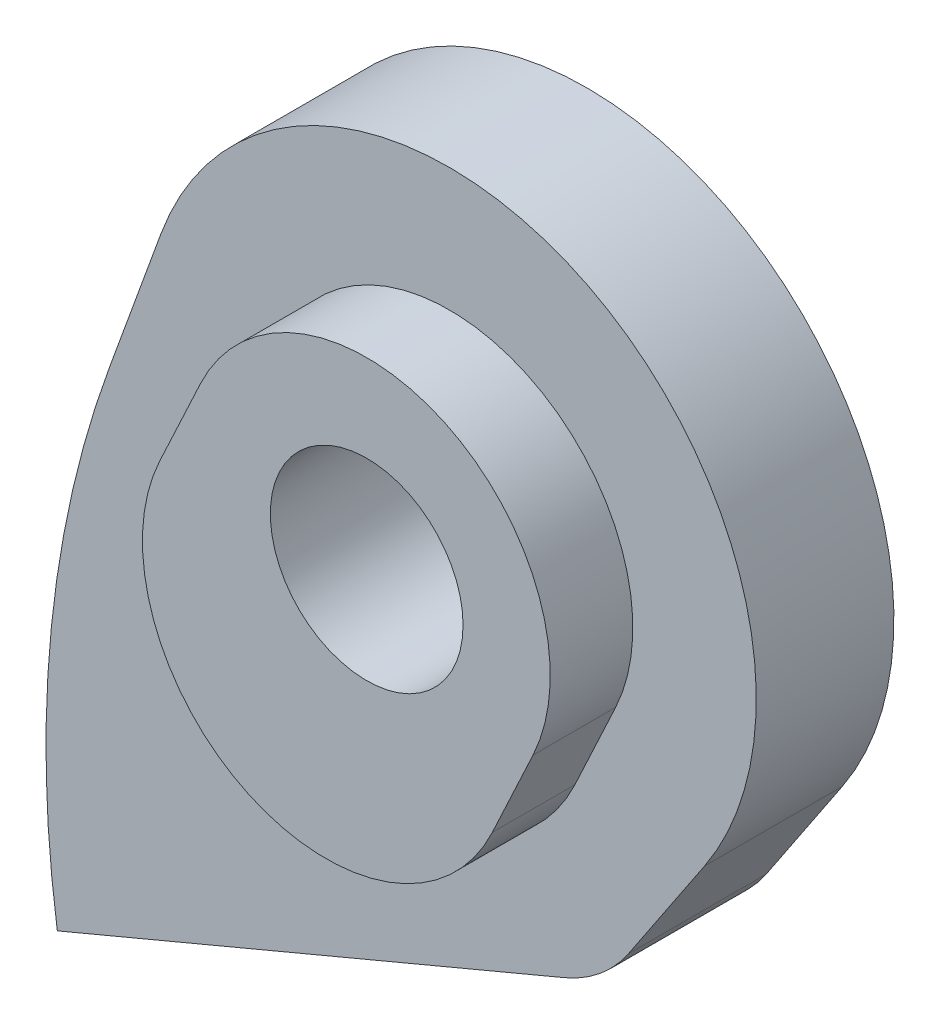
ISO-10303-21;
HEADER;
FILE_DESCRIPTION(('STEP AP214'),'2;1');
FILE_NAME('part.step','',(''),(''),'','','');
FILE_SCHEMA(('AUTOMOTIVE_DESIGN { 1 0 10303 214 1 1 1 1 }'));
ENDSEC;
DATA;
#1=APPLICATION_CONTEXT('core data for automotive mechanical design processes');
#2=APPLICATION_PROTOCOL_DEFINITION('international standard','automotive_design',2000,#1);
#3=PRODUCT_CONTEXT('',#1,'mechanical');
#4=PRODUCT('Part','Part','',(#3));
#5=PRODUCT_RELATED_PRODUCT_CATEGORY('part','',(#4));
#6=PRODUCT_DEFINITION_FORMATION('','',#4);
#7=PRODUCT_DEFINITION_CONTEXT('part definition',#1,'design');
#8=PRODUCT_DEFINITION('design','',#6,#7);
#9=PRODUCT_DEFINITION_SHAPE('','',#8);
#10=(LENGTH_UNIT() NAMED_UNIT(*) SI_UNIT(.MILLI.,.METRE.));
#11=(NAMED_UNIT(*) PLANE_ANGLE_UNIT() SI_UNIT($,.RADIAN.));
#12=(NAMED_UNIT(*) SI_UNIT($,.STERADIAN.) SOLID_ANGLE_UNIT());
#13=UNCERTAINTY_MEASURE_WITH_UNIT(LENGTH_MEASURE(1.E-05),#10,'distance_accuracy_value','');
#14=(GEOMETRIC_REPRESENTATION_CONTEXT(3) GLOBAL_UNCERTAINTY_ASSIGNED_CONTEXT((#13)) GLOBAL_UNIT_ASSIGNED_CONTEXT((#10,
#11,#12)) REPRESENTATION_CONTEXT('',''));
#15=CARTESIAN_POINT('',(0.,0.,0.));
#16=DIRECTION('',(0.,0.,1.));
#17=DIRECTION('',(1.,0.,0.));
#18=AXIS2_PLACEMENT_3D('',#15,#16,#17);
#19=CARTESIAN_POINT('',(0.11468761398859,80.1325343968941,0.));
#20=DIRECTION('',(0.,0.,1.));
#21=DIRECTION('',(1.,0.,0.));
#22=AXIS2_PLACEMENT_3D('',#19,#20,#21);
#23=PLANE('',#22);
#24=CARTESIAN_POINT('',(14.2795120747355,71.4970986035797,0.));
#25=DIRECTION('',(0.,0.,1.));
#26=DIRECTION('',(1.,0.,0.));
#27=AXIS2_PLACEMENT_3D('',#24,#25,#26);
#28=CIRCLE('',#27,22.9540740082007);
#29=CARTESIAN_POINT('',(-7.29026188774433,79.3478542857725,0.));
#30=VERTEX_POINT('',#29);
#31=CARTESIAN_POINT('',(-8.42769677737512,68.1396919078421,0.));
#32=VERTEX_POINT('',#31);
#33=EDGE_CURVE('E154',#30,#32,#28,.T.);
#34=ORIENTED_EDGE('',*,*,#33,.T.);
#35=DIRECTION('',(-0.921960246209325,-0.387284526426812,0.));
#36=VECTOR('',#35,1.);
#37=CARTESIAN_POINT('',(2.62584420432856,72.7829131335289,0.));
#38=LINE('',#37,#36);
#39=CARTESIAN_POINT('',(2.62584420432857,72.7829131335288,0.));
#40=VERTEX_POINT('',#39);
#41=EDGE_CURVE('E178',#40,#32,#38,.T.);
#42=ORIENTED_EDGE('',*,*,#41,.F.);
#43=CARTESIAN_POINT('',(1.41064938117233,75.6757767567832,0.));
#44=DIRECTION('',(0.,0.,-1.));
#45=DIRECTION('',(-1.,0.,0.));
#46=AXIS2_PLACEMENT_3D('',#43,#44,#45);
#47=CIRCLE('',#46,3.13773140994799);
#48=CARTESIAN_POINT('',(4.02035151590427,73.933705240183,0.));
#49=VERTEX_POINT('',#48);
#50=EDGE_CURVE('E173',#49,#40,#47,.T.);
#51=ORIENTED_EDGE('',*,*,#50,.F.);
#52=DIRECTION('',(0.555200968150768,0.831716228628761,0.));
#53=VECTOR('',#52,1.);
#54=CARTESIAN_POINT('',(4.02035151590429,73.933705240183,0.));
#55=LINE('',#54,#53);
#56=CARTESIAN_POINT('',(5.67886918351501,76.4182399199654,0.));
#57=VERTEX_POINT('',#56);
#58=EDGE_CURVE('E147',#49,#57,#55,.T.);
#59=ORIENTED_EDGE('',*,*,#58,.T.);
#60=CARTESIAN_POINT('',(0.11468761398859,80.1325343968941,0.));
#61=DIRECTION('',(0.,0.,1.));
#62=DIRECTION('',(1.,0.,0.));
#63=AXIS2_PLACEMENT_3D('',#60,#61,#62);
#64=CIRCLE('',#63,6.69000000000006);
#65=CARTESIAN_POINT('',(-6.17185601906935,82.4206491557424,0.));
#66=VERTEX_POINT('',#65);
#67=EDGE_CURVE('E149',#57,#66,#64,.T.);
#68=ORIENTED_EDGE('',*,*,#67,.T.);
#69=DIRECTION('',(-0.342020143325666,-0.939692620785909,0.));
#70=VECTOR('',#69,1.);
#71=CARTESIAN_POINT('',(-6.1718560190694,82.4206491557424,0.));
#72=LINE('',#71,#70);
#73=EDGE_CURVE('E155',#66,#30,#72,.T.);
#74=ORIENTED_EDGE('',*,*,#73,.T.);
#75=EDGE_LOOP('',(#34,#42,#51,#59,#68,#74));
#76=FACE_BOUND('',#75,.T.);
#77=DIRECTION('',(-0.4226182617407,-0.90630778703665,0.));
#78=VECTOR('',#77,1.);
#79=CARTESIAN_POINT('',(-3.51054353415801,81.8230074438569,0.));
#80=LINE('',#79,#78);
#81=CARTESIAN_POINT('',(-3.51054353415801,81.8230074438569,0.));
#82=VERTEX_POINT('',#81);
#83=CARTESIAN_POINT('',(-4.39804188381347,79.9197610910799,0.));
#84=VERTEX_POINT('',#83);
#85=EDGE_CURVE('E241',#82,#84,#80,.T.);
#86=ORIENTED_EDGE('',*,*,#85,.F.);
#87=CARTESIAN_POINT('',(0.114687613988609,80.1325343968941,0.));
#88=DIRECTION('',(0.,0.,1.));
#89=DIRECTION('',(1.,0.,0.));
#90=AXIS2_PLACEMENT_3D('',#87,#88,#89);
#91=CIRCLE('',#90,4.00000000000001);
#92=CARTESIAN_POINT('',(3.73991876213519,78.4420613499313,0.));
#93=VERTEX_POINT('',#92);
#94=EDGE_CURVE('E145',#93,#82,#91,.T.);
#95=ORIENTED_EDGE('',*,*,#94,.F.);
#96=DIRECTION('',(0.4226182617407,0.90630778703665,0.));
#97=VECTOR('',#96,1.);
#98=CARTESIAN_POINT('',(3.73991876213519,78.4420613499313,0.));
#99=LINE('',#98,#97);
#100=CARTESIAN_POINT('',(2.85242041247973,76.5388149971543,0.));
#101=VERTEX_POINT('',#100);
#102=EDGE_CURVE('E141',#101,#93,#99,.T.);
#103=ORIENTED_EDGE('',*,*,#102,.F.);
#104=CARTESIAN_POINT('',(-0.772810735666862,78.2292880441171,0.));
#105=DIRECTION('',(0.,0.,1.));
#106=DIRECTION('',(1.,0.,0.));
#107=AXIS2_PLACEMENT_3D('',#104,#105,#106);
#108=CIRCLE('',#107,4.00000000000001);
#109=EDGE_CURVE('E243',#84,#101,#108,.T.);
#110=ORIENTED_EDGE('',*,*,#109,.F.);
#111=EDGE_LOOP('',(#86,#95,#103,#110));
#112=FACE_BOUND('',#111,.T.);
#113=ADVANCED_FACE('F33',(#76,#112),#23,.T.);
#114=CARTESIAN_POINT('',(-8.01359795678153,76.9658058271043,-6.));
#115=DIRECTION('',(-0.921960246209324,-0.387284526426815,0.));
#116=DIRECTION('',(0.387284526426815,-0.921960246209324,0.));
#117=AXIS2_PLACEMENT_3D('',#114,#115,#116);
#118=PLANE('',#117);
#119=DIRECTION('',(0.387284526426815,-0.921960246209324,0.));
#120=VECTOR('',#119,1.);
#121=CARTESIAN_POINT('',(-8.01359795678153,76.9658058271043,-3.));
#122=LINE('',#121,#120);
#123=CARTESIAN_POINT('',(-8.01359795678153,76.9658058271043,-3.));
#124=VERTEX_POINT('',#123);
#125=CARTESIAN_POINT('',(-4.92424784177968,69.611373108264,-3.));
#126=VERTEX_POINT('',#125);
#127=EDGE_CURVE('E56',#124,#126,#122,.T.);
#128=ORIENTED_EDGE('',*,*,#127,.T.);
#129=DIRECTION('',(0.,0.,1.));
#130=VECTOR('',#129,1.);
#131=CARTESIAN_POINT('',(-4.92424784177968,69.611373108264,-6.));
#132=LINE('',#131,#130);
#133=CARTESIAN_POINT('',(-4.92424784177968,69.611373108264,-6.));
#134=VERTEX_POINT('',#133);
#135=EDGE_CURVE('E166',#134,#126,#132,.T.);
#136=ORIENTED_EDGE('',*,*,#135,.F.);
#137=DIRECTION('',(0.387284526426815,-0.921960246209324,0.));
#138=VECTOR('',#137,1.);
#139=CARTESIAN_POINT('',(-8.01359795678153,76.9658058271043,-6.));
#140=LINE('',#139,#138);
#141=CARTESIAN_POINT('',(-8.01359795678153,76.9658058271043,-6.));
#142=VERTEX_POINT('',#141);
#143=EDGE_CURVE('E164',#142,#134,#140,.T.);
#144=ORIENTED_EDGE('',*,*,#143,.F.);
#145=DIRECTION('',(0.,0.,1.));
#146=VECTOR('',#145,1.);
#147=CARTESIAN_POINT('',(-8.01359795678153,76.9658058271043,-6.));
#148=LINE('',#147,#146);
#149=EDGE_CURVE('E170',#142,#124,#148,.T.);
#150=ORIENTED_EDGE('',*,*,#149,.T.);
#151=EDGE_LOOP('',(#128,#136,#144,#150));
#152=FACE_BOUND('',#151,.T.);
#153=ADVANCED_FACE('F230',(#152),#118,.F.);
#154=CARTESIAN_POINT('',(14.2795120747355,71.4970986035797,-6.));
#155=DIRECTION('',(0.,0.,1.));
#156=DIRECTION('',(1.,0.,0.));
#157=AXIS2_PLACEMENT_3D('',#154,#155,#156);
#158=PLANE('',#157);
#159=DIRECTION('',(-0.921960246209326,-0.38728452642681,0.));
#160=VECTOR('',#159,1.);
#161=CARTESIAN_POINT('',(-4.92424784177968,69.611373108264,-6.));
#162=LINE('',#161,#160);
#163=CARTESIAN_POINT('',(-8.42769677737511,68.1396919078421,-6.));
#164=VERTEX_POINT('',#163);
#165=EDGE_CURVE('E159',#134,#164,#162,.T.);
#166=ORIENTED_EDGE('',*,*,#165,.T.);
#167=CARTESIAN_POINT('',(14.2795120747355,71.4970986035797,-6.));
#168=DIRECTION('',(0.,0.,-1.));
#169=DIRECTION('',(1.,0.,0.));
#170=AXIS2_PLACEMENT_3D('',#167,#168,#169);
#171=CIRCLE('',#170,22.9540740082007);
#172=EDGE_CURVE('E162',#164,#142,#171,.T.);
#173=ORIENTED_EDGE('',*,*,#172,.T.);
#174=ORIENTED_EDGE('',*,*,#143,.T.);
#175=EDGE_LOOP('',(#166,#173,#174));
#176=FACE_BOUND('',#175,.T.);
#177=ADVANCED_FACE('F281',(#176),#158,.F.);
#178=CARTESIAN_POINT('',(0.11468761398859,80.1325343968941,-3.));
#179=DIRECTION('',(0.,0.,1.));
#180=DIRECTION('',(1.,0.,0.));
#181=AXIS2_PLACEMENT_3D('',#178,#179,#180);
#182=PLANE('',#181);
#183=CARTESIAN_POINT('',(0.11468761398859,80.1325343968941,-3.));
#184=DIRECTION('',(0.,0.,1.));
#185=DIRECTION('',(1.,0.,0.));
#186=AXIS2_PLACEMENT_3D('',#183,#184,#185);
#187=CIRCLE('',#186,2.10000000000001);
#188=CARTESIAN_POINT('',(2.2146876139886,80.1325343968941,-3.));
#189=VERTEX_POINT('',#188);
#190=EDGE_CURVE('E246',#189,#189,#187,.T.);
#191=ORIENTED_EDGE('',*,*,#190,.T.);
#192=EDGE_LOOP('',(#191));
#193=FACE_BOUND('',#192,.T.);
#194=ORIENTED_EDGE('',*,*,#127,.F.);
#195=CARTESIAN_POINT('',(14.2795120747355,71.4970986035797,-3.));
#196=DIRECTION('',(0.,0.,-1.));
#197=DIRECTION('',(-1.,0.,0.));
#198=AXIS2_PLACEMENT_3D('',#195,#196,#197);
#199=CIRCLE('',#198,22.9540740082007);
#200=CARTESIAN_POINT('',(-7.29026188774433,79.3478542857725,-3.));
#201=VERTEX_POINT('',#200);
#202=EDGE_CURVE('E184',#124,#201,#199,.T.);
#203=ORIENTED_EDGE('',*,*,#202,.T.);
#204=DIRECTION('',(0.342020143325687,0.939692620785902,0.));
#205=VECTOR('',#204,1.);
#206=CARTESIAN_POINT('',(-6.17185601906934,82.4206491557424,-3.));
#207=LINE('',#206,#205);
#208=CARTESIAN_POINT('',(-6.17185601906934,82.4206491557424,-3.));
#209=VERTEX_POINT('',#208);
#210=EDGE_CURVE('E186',#201,#209,#207,.T.);
#211=ORIENTED_EDGE('',*,*,#210,.T.);
#212=CARTESIAN_POINT('',(0.11468761398859,80.1325343968941,-3.));
#213=DIRECTION('',(0.,0.,-1.));
#214=DIRECTION('',(1.,0.,0.));
#215=AXIS2_PLACEMENT_3D('',#212,#213,#214);
#216=CIRCLE('',#215,6.69000000000002);
#217=CARTESIAN_POINT('',(5.67886918351501,76.4182399199654,-3.));
#218=VERTEX_POINT('',#217);
#219=EDGE_CURVE('E174',#209,#218,#216,.T.);
#220=ORIENTED_EDGE('',*,*,#219,.T.);
#221=DIRECTION('',(-0.555200968150769,-0.83171622862876,0.));
#222=VECTOR('',#221,1.);
#223=CARTESIAN_POINT('',(5.67886918351501,76.4182399199654,-3.));
#224=LINE('',#223,#222);
#225=CARTESIAN_POINT('',(4.02035151590429,73.933705240183,-3.));
#226=VERTEX_POINT('',#225);
#227=EDGE_CURVE('E177',#218,#226,#224,.T.);
#228=ORIENTED_EDGE('',*,*,#227,.T.);
#229=CARTESIAN_POINT('',(1.41064938117233,75.6757767567832,-3.));
#230=DIRECTION('',(0.,0.,-1.));
#231=DIRECTION('',(-1.,0.,0.));
#232=AXIS2_PLACEMENT_3D('',#229,#230,#231);
#233=CIRCLE('',#232,3.13773140994799);
#234=CARTESIAN_POINT('',(2.62584420432857,72.7829131335288,-3.));
#235=VERTEX_POINT('',#234);
#236=EDGE_CURVE('E180',#226,#235,#233,.T.);
#237=ORIENTED_EDGE('',*,*,#236,.T.);
#238=DIRECTION('',(-0.921960246209325,-0.387284526426812,0.));
#239=VECTOR('',#238,1.);
#240=CARTESIAN_POINT('',(2.62584420432856,72.7829131335289,-3.));
#241=LINE('',#240,#239);
#242=EDGE_CURVE('E182',#235,#126,#241,.T.);
#243=ORIENTED_EDGE('',*,*,#242,.T.);
#244=EDGE_LOOP('',(#194,#203,#211,#220,#228,#237,#243));
#245=FACE_BOUND('',#244,.T.);
#246=ADVANCED_FACE('F212',(#193,#245),#182,.F.);
#247=CARTESIAN_POINT('',(1.41064938117233,75.6757767567832,-3.));
#248=DIRECTION('',(0.,0.,1.));
#249=DIRECTION('',(1.,0.,0.));
#250=AXIS2_PLACEMENT_3D('',#247,#248,#249);
#251=CYLINDRICAL_SURFACE('',#250,3.13773140994799);
#252=ORIENTED_EDGE('',*,*,#50,.T.);
#253=DIRECTION('',(0.,0.,1.));
#254=VECTOR('',#253,1.);
#255=CARTESIAN_POINT('',(2.62584420432857,72.7829131335288,-3.));
#256=LINE('',#255,#254);
#257=EDGE_CURVE('E196',#235,#40,#256,.T.);
#258=ORIENTED_EDGE('',*,*,#257,.F.);
#259=ORIENTED_EDGE('',*,*,#236,.F.);
#260=DIRECTION('',(0.,0.,1.));
#261=VECTOR('',#260,1.);
#262=CARTESIAN_POINT('',(4.02035151590429,73.933705240183,-3.));
#263=LINE('',#262,#261);
#264=EDGE_CURVE('E199',#226,#49,#263,.T.);
#265=ORIENTED_EDGE('',*,*,#264,.T.);
#266=EDGE_LOOP('',(#252,#258,#259,#265));
#267=FACE_BOUND('',#266,.T.);
#268=ADVANCED_FACE('F223',(#267),#251,.T.);
#269=CARTESIAN_POINT('',(2.62584420432856,72.7829131335289,-3.));
#270=DIRECTION('',(-0.387284526426812,0.921960246209325,0.));
#271=DIRECTION('',(-0.921960246209325,-0.387284526426812,0.));
#272=AXIS2_PLACEMENT_3D('',#269,#270,#271);
#273=PLANE('',#272);
#274=ORIENTED_EDGE('',*,*,#41,.T.);
#275=DIRECTION('',(0.,0.,1.));
#276=VECTOR('',#275,1.);
#277=CARTESIAN_POINT('',(-8.42769677737511,68.1396919078421,-3.));
#278=LINE('',#277,#276);
#279=EDGE_CURVE('E189',#164,#32,#278,.T.);
#280=ORIENTED_EDGE('',*,*,#279,.F.);
#281=ORIENTED_EDGE('',*,*,#165,.F.);
#282=ORIENTED_EDGE('',*,*,#135,.T.);
#283=ORIENTED_EDGE('',*,*,#242,.F.);
#284=ORIENTED_EDGE('',*,*,#257,.T.);
#285=EDGE_LOOP('',(#274,#280,#281,#282,#283,#284));
#286=FACE_BOUND('',#285,.T.);
#287=ADVANCED_FACE('F225',(#286),#273,.F.);
#288=CARTESIAN_POINT('',(14.2795120747355,71.4970986035797,11.));
#289=DIRECTION('',(0.,0.,-1.));
#290=DIRECTION('',(-1.,0.,0.));
#291=AXIS2_PLACEMENT_3D('',#288,#289,#290);
#292=CYLINDRICAL_SURFACE('',#291,22.9540740082007);
#293=ORIENTED_EDGE('',*,*,#33,.F.);
#294=DIRECTION('',(0.,0.,-1.));
#295=VECTOR('',#294,1.);
#296=CARTESIAN_POINT('',(-7.29026188774433,79.3478542857725,11.));
#297=LINE('',#296,#295);
#298=EDGE_CURVE('E202',#30,#201,#297,.T.);
#299=ORIENTED_EDGE('',*,*,#298,.T.);
#300=ORIENTED_EDGE('',*,*,#202,.F.);
#301=ORIENTED_EDGE('',*,*,#149,.F.);
#302=ORIENTED_EDGE('',*,*,#172,.F.);
#303=ORIENTED_EDGE('',*,*,#279,.T.);
#304=EDGE_LOOP('',(#293,#299,#300,#301,#302,#303));
#305=FACE_BOUND('',#304,.T.);
#306=ADVANCED_FACE('F235',(#305),#292,.T.);
#307=CARTESIAN_POINT('',(-6.1718560190694,82.4206491557424,11.));
#308=DIRECTION('',(0.939692620785909,-0.342020143325666,0.));
#309=DIRECTION('',(0.342020143325666,0.939692620785909,0.));
#310=AXIS2_PLACEMENT_3D('',#307,#308,#309);
#311=PLANE('',#310);
#312=ORIENTED_EDGE('',*,*,#73,.F.);
#313=DIRECTION('',(0.,0.,-1.));
#314=VECTOR('',#313,1.);
#315=CARTESIAN_POINT('',(-6.17185601906935,82.4206491557424,11.));
#316=LINE('',#315,#314);
#317=EDGE_CURVE('E41',#66,#209,#316,.T.);
#318=ORIENTED_EDGE('',*,*,#317,.T.);
#319=ORIENTED_EDGE('',*,*,#210,.F.);
#320=ORIENTED_EDGE('',*,*,#298,.F.);
#321=EDGE_LOOP('',(#312,#318,#319,#320));
#322=FACE_BOUND('',#321,.T.);
#323=ADVANCED_FACE('F207',(#322),#311,.F.);
#324=CARTESIAN_POINT('',(0.11468761398859,80.1325343968941,11.));
#325=DIRECTION('',(0.,0.,-1.));
#326=DIRECTION('',(-1.,0.,0.));
#327=AXIS2_PLACEMENT_3D('',#324,#325,#326);
#328=CYLINDRICAL_SURFACE('',#327,6.69000000000006);
#329=ORIENTED_EDGE('',*,*,#317,.F.);
#330=ORIENTED_EDGE('',*,*,#67,.F.);
#331=DIRECTION('',(0.,0.,-1.));
#332=VECTOR('',#331,1.);
#333=CARTESIAN_POINT('',(5.67886918351501,76.4182399199654,11.));
#334=LINE('',#333,#332);
#335=EDGE_CURVE('E11',#57,#218,#334,.T.);
#336=ORIENTED_EDGE('',*,*,#335,.T.);
#337=ORIENTED_EDGE('',*,*,#219,.F.);
#338=EDGE_LOOP('',(#329,#330,#336,#337));
#339=FACE_BOUND('',#338,.T.);
#340=ADVANCED_FACE('F213',(#339),#328,.T.);
#341=CARTESIAN_POINT('',(4.02035151590429,73.933705240183,11.));
#342=DIRECTION('',(-0.831716228628761,0.555200968150768,0.));
#343=DIRECTION('',(-0.555200968150768,-0.831716228628761,0.));
#344=AXIS2_PLACEMENT_3D('',#341,#342,#343);
#345=PLANE('',#344);
#346=ORIENTED_EDGE('',*,*,#58,.F.);
#347=ORIENTED_EDGE('',*,*,#264,.F.);
#348=ORIENTED_EDGE('',*,*,#227,.F.);
#349=ORIENTED_EDGE('',*,*,#335,.F.);
#350=EDGE_LOOP('',(#346,#347,#348,#349));
#351=FACE_BOUND('',#350,.T.);
#352=ADVANCED_FACE('F35',(#351),#345,.F.);
#353=CARTESIAN_POINT('',(0.114687613988609,80.1325343968941,1.8));
#354=DIRECTION('',(0.,0.,-1.));
#355=DIRECTION('',(-1.,0.,0.));
#356=AXIS2_PLACEMENT_3D('',#353,#354,#355);
#357=CYLINDRICAL_SURFACE('',#356,4.00000000000001);
#358=ORIENTED_EDGE('',*,*,#94,.T.);
#359=DIRECTION('',(0.,0.,-1.));
#360=VECTOR('',#359,1.);
#361=CARTESIAN_POINT('',(-3.51054353415801,81.8230074438569,1.8));
#362=LINE('',#361,#360);
#363=CARTESIAN_POINT('',(-3.51054353415801,81.8230074438569,1.8));
#364=VERTEX_POINT('',#363);
#365=EDGE_CURVE('E126',#364,#82,#362,.T.);
#366=ORIENTED_EDGE('',*,*,#365,.F.);
#367=CARTESIAN_POINT('',(0.114687613988609,80.1325343968941,1.8));
#368=DIRECTION('',(0.,0.,1.));
#369=DIRECTION('',(1.,0.,0.));
#370=AXIS2_PLACEMENT_3D('',#367,#368,#369);
#371=CIRCLE('',#370,4.00000000000001);
#372=CARTESIAN_POINT('',(3.73991876213519,78.4420613499313,1.8));
#373=VERTEX_POINT('',#372);
#374=EDGE_CURVE('E133',#373,#364,#371,.T.);
#375=ORIENTED_EDGE('',*,*,#374,.F.);
#376=DIRECTION('',(0.,0.,-1.));
#377=VECTOR('',#376,1.);
#378=CARTESIAN_POINT('',(3.73991876213519,78.4420613499313,1.8));
#379=LINE('',#378,#377);
#380=EDGE_CURVE('E251',#373,#93,#379,.T.);
#381=ORIENTED_EDGE('',*,*,#380,.T.);
#382=EDGE_LOOP('',(#358,#366,#375,#381));
#383=FACE_BOUND('',#382,.T.);
#384=ADVANCED_FACE('F143',(#383),#357,.T.);
#385=CARTESIAN_POINT('',(-3.51054353415801,81.8230074438569,1.8));
#386=DIRECTION('',(0.90630778703665,-0.4226182617407,0.));
#387=DIRECTION('',(0.4226182617407,0.90630778703665,0.));
#388=AXIS2_PLACEMENT_3D('',#385,#386,#387);
#389=PLANE('',#388);
#390=ORIENTED_EDGE('',*,*,#85,.T.);
#391=DIRECTION('',(0.,0.,-1.));
#392=VECTOR('',#391,1.);
#393=CARTESIAN_POINT('',(-4.39804188381347,79.9197610910799,1.8));
#394=LINE('',#393,#392);
#395=CARTESIAN_POINT('',(-4.39804188381347,79.9197610910799,1.8));
#396=VERTEX_POINT('',#395);
#397=EDGE_CURVE('E129',#396,#84,#394,.T.);
#398=ORIENTED_EDGE('',*,*,#397,.F.);
#399=DIRECTION('',(-0.4226182617407,-0.90630778703665,0.));
#400=VECTOR('',#399,1.);
#401=CARTESIAN_POINT('',(-3.51054353415801,81.8230074438569,1.8));
#402=LINE('',#401,#400);
#403=EDGE_CURVE('E122',#364,#396,#402,.T.);
#404=ORIENTED_EDGE('',*,*,#403,.F.);
#405=ORIENTED_EDGE('',*,*,#365,.T.);
#406=EDGE_LOOP('',(#390,#398,#404,#405));
#407=FACE_BOUND('',#406,.T.);
#408=ADVANCED_FACE('F124',(#407),#389,.F.);
#409=CARTESIAN_POINT('',(-0.772810735666862,78.2292880441171,1.8));
#410=DIRECTION('',(0.,0.,-1.));
#411=DIRECTION('',(-1.,0.,0.));
#412=AXIS2_PLACEMENT_3D('',#409,#410,#411);
#413=CYLINDRICAL_SURFACE('',#412,4.00000000000001);
#414=ORIENTED_EDGE('',*,*,#109,.T.);
#415=DIRECTION('',(0.,0.,-1.));
#416=VECTOR('',#415,1.);
#417=CARTESIAN_POINT('',(2.85242041247973,76.5388149971543,1.8));
#418=LINE('',#417,#416);
#419=CARTESIAN_POINT('',(2.85242041247973,76.5388149971543,1.8));
#420=VERTEX_POINT('',#419);
#421=EDGE_CURVE('E48',#420,#101,#418,.T.);
#422=ORIENTED_EDGE('',*,*,#421,.F.);
#423=CARTESIAN_POINT('',(-0.772810735666862,78.2292880441171,1.8));
#424=DIRECTION('',(0.,0.,1.));
#425=DIRECTION('',(1.,0.,0.));
#426=AXIS2_PLACEMENT_3D('',#423,#424,#425);
#427=CIRCLE('',#426,4.00000000000001);
#428=EDGE_CURVE('E132',#396,#420,#427,.T.);
#429=ORIENTED_EDGE('',*,*,#428,.F.);
#430=ORIENTED_EDGE('',*,*,#397,.T.);
#431=EDGE_LOOP('',(#414,#422,#429,#430));
#432=FACE_BOUND('',#431,.T.);
#433=ADVANCED_FACE('F271',(#432),#413,.T.);
#434=CARTESIAN_POINT('',(3.73991876213519,78.4420613499313,1.8));
#435=DIRECTION('',(-0.90630778703665,0.4226182617407,0.));
#436=DIRECTION('',(-0.4226182617407,-0.90630778703665,0.));
#437=AXIS2_PLACEMENT_3D('',#434,#435,#436);
#438=PLANE('',#437);
#439=ORIENTED_EDGE('',*,*,#102,.T.);
#440=ORIENTED_EDGE('',*,*,#380,.F.);
#441=DIRECTION('',(0.4226182617407,0.90630778703665,0.));
#442=VECTOR('',#441,1.);
#443=CARTESIAN_POINT('',(3.73991876213519,78.4420613499313,1.8));
#444=LINE('',#443,#442);
#445=EDGE_CURVE('E137',#420,#373,#444,.T.);
#446=ORIENTED_EDGE('',*,*,#445,.F.);
#447=ORIENTED_EDGE('',*,*,#421,.T.);
#448=EDGE_LOOP('',(#439,#440,#446,#447));
#449=FACE_BOUND('',#448,.T.);
#450=ADVANCED_FACE('F264',(#449),#438,.F.);
#451=CARTESIAN_POINT('',(0.114687613988609,80.1325343968941,1.8));
#452=DIRECTION('',(0.,0.,1.));
#453=DIRECTION('',(1.,0.,0.));
#454=AXIS2_PLACEMENT_3D('',#451,#452,#453);
#455=PLANE('',#454);
#456=CARTESIAN_POINT('',(0.11468761398859,80.1325343968941,1.8));
#457=DIRECTION('',(0.,0.,1.));
#458=DIRECTION('',(1.,0.,0.));
#459=AXIS2_PLACEMENT_3D('',#456,#457,#458);
#460=CIRCLE('',#459,2.10000000000001);
#461=CARTESIAN_POINT('',(2.2146876139886,80.1325343968941,1.8));
#462=VERTEX_POINT('',#461);
#463=EDGE_CURVE('E256',#462,#462,#460,.T.);
#464=ORIENTED_EDGE('',*,*,#463,.F.);
#465=EDGE_LOOP('',(#464));
#466=FACE_BOUND('',#465,.T.);
#467=ORIENTED_EDGE('',*,*,#374,.T.);
#468=ORIENTED_EDGE('',*,*,#403,.T.);
#469=ORIENTED_EDGE('',*,*,#428,.T.);
#470=ORIENTED_EDGE('',*,*,#445,.T.);
#471=EDGE_LOOP('',(#467,#468,#469,#470));
#472=FACE_BOUND('',#471,.T.);
#473=ADVANCED_FACE('F136',(#466,#472),#455,.T.);
#474=CARTESIAN_POINT('',(0.11468761398859,80.1325343968941,-6.));
#475=DIRECTION('',(0.,0.,1.));
#476=DIRECTION('',(1.,0.,0.));
#477=AXIS2_PLACEMENT_3D('',#474,#475,#476);
#478=CYLINDRICAL_SURFACE('',#477,2.10000000000001);
#479=ORIENTED_EDGE('',*,*,#463,.T.);
#480=EDGE_LOOP('',(#479));
#481=FACE_BOUND('',#480,.T.);
#482=ORIENTED_EDGE('',*,*,#190,.F.);
#483=EDGE_LOOP('',(#482));
#484=FACE_BOUND('',#483,.T.);
#485=ADVANCED_FACE('F260',(#481,#484),#478,.F.);
#486=CLOSED_SHELL('',(#113,#153,#177,#246,#268,#287,#306,#323,#340,#352,#384,#408,#433,#450,
#473,#485));
#487=MANIFOLD_SOLID_BREP('B2',#486);
#488=ADVANCED_BREP_SHAPE_REPRESENTATION('',(#18,#487),#14);
#489=SHAPE_DEFINITION_REPRESENTATION(#9,#488);
ENDSEC;
END-ISO-10303-21;
